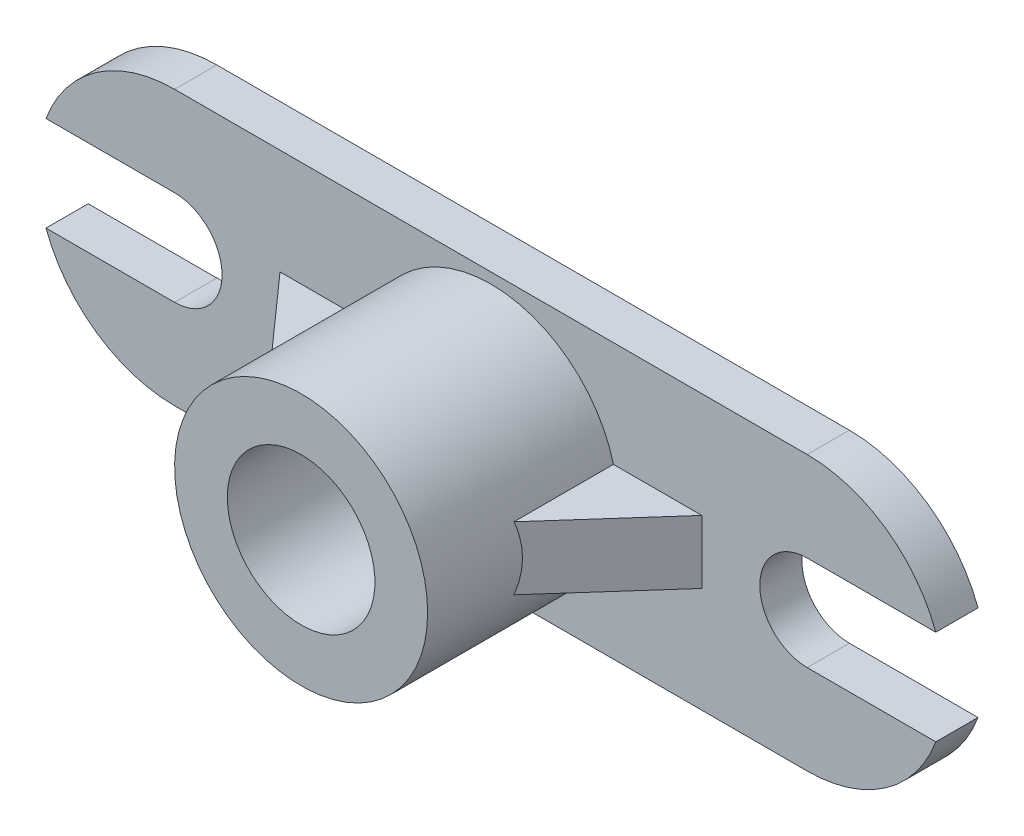
ISO-10303-21;
HEADER;
FILE_DESCRIPTION(('STEP AP214'),'2;1');
FILE_NAME('part.step','',(''),(''),'','','');
FILE_SCHEMA(('AUTOMOTIVE_DESIGN { 1 0 10303 214 1 1 1 1 }'));
ENDSEC;
DATA;
#1=APPLICATION_CONTEXT('core data for automotive mechanical design processes');
#2=APPLICATION_PROTOCOL_DEFINITION('international standard','automotive_design',2000,#1);
#3=PRODUCT_CONTEXT('',#1,'mechanical');
#4=PRODUCT('Part','Part','',(#3));
#5=PRODUCT_RELATED_PRODUCT_CATEGORY('part','',(#4));
#6=PRODUCT_DEFINITION_FORMATION('','',#4);
#7=PRODUCT_DEFINITION_CONTEXT('part definition',#1,'design');
#8=PRODUCT_DEFINITION('design','',#6,#7);
#9=PRODUCT_DEFINITION_SHAPE('','',#8);
#10=(LENGTH_UNIT() NAMED_UNIT(*) SI_UNIT(.MILLI.,.METRE.));
#11=(NAMED_UNIT(*) PLANE_ANGLE_UNIT() SI_UNIT($,.RADIAN.));
#12=(NAMED_UNIT(*) SI_UNIT($,.STERADIAN.) SOLID_ANGLE_UNIT());
#13=UNCERTAINTY_MEASURE_WITH_UNIT(LENGTH_MEASURE(1.E-05),#10,'distance_accuracy_value','');
#14=(GEOMETRIC_REPRESENTATION_CONTEXT(3) GLOBAL_UNCERTAINTY_ASSIGNED_CONTEXT((#13)) GLOBAL_UNIT_ASSIGNED_CONTEXT((#10,
#11,#12)) REPRESENTATION_CONTEXT('',''));
#15=CARTESIAN_POINT('',(0.,0.,0.));
#16=DIRECTION('',(0.,0.,1.));
#17=DIRECTION('',(1.,0.,0.));
#18=AXIS2_PLACEMENT_3D('',#15,#16,#17);
#19=CARTESIAN_POINT('',(30.,0.,2.));
#20=DIRECTION('',(0.,0.,-1.));
#21=DIRECTION('',(-1.,0.,0.));
#22=AXIS2_PLACEMENT_3D('',#19,#20,#21);
#23=CYLINDRICAL_SURFACE('',#22,2.25);
#24=CARTESIAN_POINT('',(30.,0.,2.));
#25=DIRECTION('',(0.,0.,1.));
#26=DIRECTION('',(1.,0.,0.));
#27=AXIS2_PLACEMENT_3D('',#24,#25,#26);
#28=CIRCLE('',#27,2.25);
#29=CARTESIAN_POINT('',(30.,2.25,2.));
#30=VERTEX_POINT('',#29);
#31=CARTESIAN_POINT('',(30.,-2.25,2.));
#32=VERTEX_POINT('',#31);
#33=EDGE_CURVE('E213',#30,#32,#28,.T.);
#34=ORIENTED_EDGE('',*,*,#33,.T.);
#35=DIRECTION('',(0.,0.,-1.));
#36=VECTOR('',#35,1.);
#37=CARTESIAN_POINT('',(30.,-2.25,2.));
#38=LINE('',#37,#36);
#39=CARTESIAN_POINT('',(30.,-2.25,0.));
#40=VERTEX_POINT('',#39);
#41=EDGE_CURVE('E242',#32,#40,#38,.T.);
#42=ORIENTED_EDGE('',*,*,#41,.T.);
#43=CARTESIAN_POINT('',(30.,0.,0.));
#44=DIRECTION('',(0.,0.,1.));
#45=DIRECTION('',(1.,0.,0.));
#46=AXIS2_PLACEMENT_3D('',#43,#44,#45);
#47=CIRCLE('',#46,2.25);
#48=CARTESIAN_POINT('',(30.,2.25,0.));
#49=VERTEX_POINT('',#48);
#50=EDGE_CURVE('E210',#49,#40,#47,.T.);
#51=ORIENTED_EDGE('',*,*,#50,.F.);
#52=DIRECTION('',(0.,0.,-1.));
#53=VECTOR('',#52,1.);
#54=CARTESIAN_POINT('',(30.,2.25,2.));
#55=LINE('',#54,#53);
#56=EDGE_CURVE('E295',#30,#49,#55,.T.);
#57=ORIENTED_EDGE('',*,*,#56,.F.);
#58=EDGE_LOOP('',(#34,#42,#51,#57));
#59=FACE_BOUND('',#58,.T.);
#60=ADVANCED_FACE('F37',(#59),#23,.F.);
#61=CARTESIAN_POINT('',(0.,2.24999999999999,2.));
#62=DIRECTION('',(0.,1.,0.));
#63=DIRECTION('',(-1.,0.,0.));
#64=AXIS2_PLACEMENT_3D('',#61,#62,#63);
#65=PLANE('',#64);
#66=DIRECTION('',(1.,0.,0.));
#67=VECTOR('',#66,1.);
#68=CARTESIAN_POINT('',(0.,2.24999999999999,0.));
#69=LINE('',#68,#67);
#70=CARTESIAN_POINT('',(36.0981554588252,2.25,0.));
#71=VERTEX_POINT('',#70);
#72=EDGE_CURVE('E244',#49,#71,#69,.T.);
#73=ORIENTED_EDGE('',*,*,#72,.T.);
#74=DIRECTION('',(0.,0.,-1.));
#75=VECTOR('',#74,1.);
#76=CARTESIAN_POINT('',(36.0981554588252,2.25,2.));
#77=LINE('',#76,#75);
#78=CARTESIAN_POINT('',(36.0981554588252,2.25,2.));
#79=VERTEX_POINT('',#78);
#80=EDGE_CURVE('E292',#79,#71,#77,.T.);
#81=ORIENTED_EDGE('',*,*,#80,.F.);
#82=DIRECTION('',(1.,0.,0.));
#83=VECTOR('',#82,1.);
#84=CARTESIAN_POINT('',(0.,2.24999999999999,2.));
#85=LINE('',#84,#83);
#86=EDGE_CURVE('E215',#30,#79,#85,.T.);
#87=ORIENTED_EDGE('',*,*,#86,.F.);
#88=ORIENTED_EDGE('',*,*,#56,.T.);
#89=EDGE_LOOP('',(#73,#81,#87,#88));
#90=FACE_BOUND('',#89,.T.);
#91=ADVANCED_FACE('F322',(#90),#65,.F.);
#92=CARTESIAN_POINT('',(30.,0.,2.));
#93=DIRECTION('',(0.,0.,-1.));
#94=DIRECTION('',(-1.,0.,0.));
#95=AXIS2_PLACEMENT_3D('',#92,#93,#94);
#96=CYLINDRICAL_SURFACE('',#95,6.5);
#97=CARTESIAN_POINT('',(30.,0.,0.));
#98=DIRECTION('',(0.,0.,1.));
#99=DIRECTION('',(1.,0.,0.));
#100=AXIS2_PLACEMENT_3D('',#97,#98,#99);
#101=CIRCLE('',#100,6.5);
#102=CARTESIAN_POINT('',(30.,6.5,0.));
#103=VERTEX_POINT('',#102);
#104=EDGE_CURVE('E246',#71,#103,#101,.T.);
#105=ORIENTED_EDGE('',*,*,#104,.T.);
#106=DIRECTION('',(0.,0.,-1.));
#107=VECTOR('',#106,1.);
#108=CARTESIAN_POINT('',(30.,6.5,2.));
#109=LINE('',#108,#107);
#110=CARTESIAN_POINT('',(30.,6.5,2.));
#111=VERTEX_POINT('',#110);
#112=EDGE_CURVE('E290',#111,#103,#109,.T.);
#113=ORIENTED_EDGE('',*,*,#112,.F.);
#114=CARTESIAN_POINT('',(30.,0.,2.));
#115=DIRECTION('',(0.,0.,1.));
#116=DIRECTION('',(1.,0.,0.));
#117=AXIS2_PLACEMENT_3D('',#114,#115,#116);
#118=CIRCLE('',#117,6.5);
#119=EDGE_CURVE('E218',#79,#111,#118,.T.);
#120=ORIENTED_EDGE('',*,*,#119,.F.);
#121=ORIENTED_EDGE('',*,*,#80,.T.);
#122=EDGE_LOOP('',(#105,#113,#120,#121));
#123=FACE_BOUND('',#122,.T.);
#124=ADVANCED_FACE('F327',(#123),#96,.T.);
#125=CARTESIAN_POINT('',(0.,6.5,2.));
#126=DIRECTION('',(0.,1.,0.));
#127=DIRECTION('',(0.,0.,1.));
#128=AXIS2_PLACEMENT_3D('',#125,#126,#127);
#129=PLANE('',#128);
#130=DIRECTION('',(1.,0.,0.));
#131=VECTOR('',#130,1.);
#132=CARTESIAN_POINT('',(0.,6.5,0.));
#133=LINE('',#132,#131);
#134=CARTESIAN_POINT('',(0.,6.5,0.));
#135=VERTEX_POINT('',#134);
#136=EDGE_CURVE('E249',#135,#103,#133,.T.);
#137=ORIENTED_EDGE('',*,*,#136,.F.);
#138=DIRECTION('',(0.,0.,-1.));
#139=VECTOR('',#138,1.);
#140=CARTESIAN_POINT('',(0.,6.5,2.));
#141=LINE('',#140,#139);
#142=CARTESIAN_POINT('',(0.,6.5,2.));
#143=VERTEX_POINT('',#142);
#144=EDGE_CURVE('E288',#143,#135,#141,.T.);
#145=ORIENTED_EDGE('',*,*,#144,.F.);
#146=DIRECTION('',(1.,0.,0.));
#147=VECTOR('',#146,1.);
#148=CARTESIAN_POINT('',(0.,6.5,2.));
#149=LINE('',#148,#147);
#150=EDGE_CURVE('E220',#143,#111,#149,.T.);
#151=ORIENTED_EDGE('',*,*,#150,.T.);
#152=ORIENTED_EDGE('',*,*,#112,.T.);
#153=EDGE_LOOP('',(#137,#145,#151,#152));
#154=FACE_BOUND('',#153,.T.);
#155=ADVANCED_FACE('F360',(#154),#129,.T.);
#156=CARTESIAN_POINT('',(0.,0.,2.));
#157=DIRECTION('',(0.,0.,-1.));
#158=DIRECTION('',(-1.,0.,0.));
#159=AXIS2_PLACEMENT_3D('',#156,#157,#158);
#160=CYLINDRICAL_SURFACE('',#159,6.5);
#161=CARTESIAN_POINT('',(0.,0.,0.));
#162=DIRECTION('',(0.,0.,1.));
#163=DIRECTION('',(1.,0.,0.));
#164=AXIS2_PLACEMENT_3D('',#161,#162,#163);
#165=CIRCLE('',#164,6.5);
#166=CARTESIAN_POINT('',(-6.09815545882523,2.25,0.));
#167=VERTEX_POINT('',#166);
#168=EDGE_CURVE('E253',#135,#167,#165,.T.);
#169=ORIENTED_EDGE('',*,*,#168,.T.);
#170=DIRECTION('',(0.,0.,-1.));
#171=VECTOR('',#170,1.);
#172=CARTESIAN_POINT('',(-6.09815545882523,2.25,2.));
#173=LINE('',#172,#171);
#174=CARTESIAN_POINT('',(-6.09815545882523,2.25,2.));
#175=VERTEX_POINT('',#174);
#176=EDGE_CURVE('E286',#175,#167,#173,.T.);
#177=ORIENTED_EDGE('',*,*,#176,.F.);
#178=CARTESIAN_POINT('',(0.,0.,2.));
#179=DIRECTION('',(0.,0.,1.));
#180=DIRECTION('',(1.,0.,0.));
#181=AXIS2_PLACEMENT_3D('',#178,#179,#180);
#182=CIRCLE('',#181,6.5);
#183=EDGE_CURVE('E224',#143,#175,#182,.T.);
#184=ORIENTED_EDGE('',*,*,#183,.F.);
#185=ORIENTED_EDGE('',*,*,#144,.T.);
#186=EDGE_LOOP('',(#169,#177,#184,#185));
#187=FACE_BOUND('',#186,.T.);
#188=ADVANCED_FACE('F363',(#187),#160,.T.);
#189=CARTESIAN_POINT('',(0.,2.25,2.));
#190=DIRECTION('',(0.,-1.,0.));
#191=DIRECTION('',(1.,0.,0.));
#192=AXIS2_PLACEMENT_3D('',#189,#190,#191);
#193=PLANE('',#192);
#194=DIRECTION('',(-1.,0.,0.));
#195=VECTOR('',#194,1.);
#196=CARTESIAN_POINT('',(0.,2.25,0.));
#197=LINE('',#196,#195);
#198=CARTESIAN_POINT('',(0.,2.25,0.));
#199=VERTEX_POINT('',#198);
#200=EDGE_CURVE('E256',#199,#167,#197,.T.);
#201=ORIENTED_EDGE('',*,*,#200,.F.);
#202=DIRECTION('',(0.,0.,-1.));
#203=VECTOR('',#202,1.);
#204=CARTESIAN_POINT('',(0.,2.25,2.));
#205=LINE('',#204,#203);
#206=CARTESIAN_POINT('',(0.,2.25,2.));
#207=VERTEX_POINT('',#206);
#208=EDGE_CURVE('E283',#207,#199,#205,.T.);
#209=ORIENTED_EDGE('',*,*,#208,.F.);
#210=DIRECTION('',(-1.,0.,0.));
#211=VECTOR('',#210,1.);
#212=CARTESIAN_POINT('',(0.,2.25,2.));
#213=LINE('',#212,#211);
#214=EDGE_CURVE('E226',#207,#175,#213,.T.);
#215=ORIENTED_EDGE('',*,*,#214,.T.);
#216=ORIENTED_EDGE('',*,*,#176,.T.);
#217=EDGE_LOOP('',(#201,#209,#215,#216));
#218=FACE_BOUND('',#217,.T.);
#219=ADVANCED_FACE('F367',(#218),#193,.T.);
#220=CARTESIAN_POINT('',(0.,0.,2.));
#221=DIRECTION('',(0.,0.,-1.));
#222=DIRECTION('',(-1.,0.,0.));
#223=AXIS2_PLACEMENT_3D('',#220,#221,#222);
#224=CYLINDRICAL_SURFACE('',#223,2.25);
#225=CARTESIAN_POINT('',(0.,0.,2.));
#226=DIRECTION('',(0.,0.,1.));
#227=DIRECTION('',(1.,0.,0.));
#228=AXIS2_PLACEMENT_3D('',#225,#226,#227);
#229=CIRCLE('',#228,2.25);
#230=CARTESIAN_POINT('',(0.,-2.25,2.));
#231=VERTEX_POINT('',#230);
#232=EDGE_CURVE('E230',#231,#207,#229,.T.);
#233=ORIENTED_EDGE('',*,*,#232,.T.);
#234=ORIENTED_EDGE('',*,*,#208,.T.);
#235=CARTESIAN_POINT('',(0.,0.,0.));
#236=DIRECTION('',(0.,0.,1.));
#237=DIRECTION('',(1.,0.,0.));
#238=AXIS2_PLACEMENT_3D('',#235,#236,#237);
#239=CIRCLE('',#238,2.25);
#240=CARTESIAN_POINT('',(0.,-2.25,0.));
#241=VERTEX_POINT('',#240);
#242=EDGE_CURVE('E260',#241,#199,#239,.T.);
#243=ORIENTED_EDGE('',*,*,#242,.F.);
#244=DIRECTION('',(0.,0.,-1.));
#245=VECTOR('',#244,1.);
#246=CARTESIAN_POINT('',(0.,-2.25,2.));
#247=LINE('',#246,#245);
#248=EDGE_CURVE('E281',#231,#241,#247,.T.);
#249=ORIENTED_EDGE('',*,*,#248,.F.);
#250=EDGE_LOOP('',(#233,#234,#243,#249));
#251=FACE_BOUND('',#250,.T.);
#252=ADVANCED_FACE('F372',(#251),#224,.F.);
#253=CARTESIAN_POINT('',(0.,-2.25,2.));
#254=DIRECTION('',(0.,-1.,0.));
#255=DIRECTION('',(1.,0.,0.));
#256=AXIS2_PLACEMENT_3D('',#253,#254,#255);
#257=PLANE('',#256);
#258=DIRECTION('',(-1.,0.,0.));
#259=VECTOR('',#258,1.);
#260=CARTESIAN_POINT('',(0.,-2.25,0.));
#261=LINE('',#260,#259);
#262=CARTESIAN_POINT('',(-6.09815545882523,-2.25,0.));
#263=VERTEX_POINT('',#262);
#264=EDGE_CURVE('E262',#241,#263,#261,.T.);
#265=ORIENTED_EDGE('',*,*,#264,.T.);
#266=DIRECTION('',(0.,0.,-1.));
#267=VECTOR('',#266,1.);
#268=CARTESIAN_POINT('',(-6.09815545882523,-2.25,2.));
#269=LINE('',#268,#267);
#270=CARTESIAN_POINT('',(-6.09815545882523,-2.25,2.));
#271=VERTEX_POINT('',#270);
#272=EDGE_CURVE('E278',#271,#263,#269,.T.);
#273=ORIENTED_EDGE('',*,*,#272,.F.);
#274=DIRECTION('',(-1.,0.,0.));
#275=VECTOR('',#274,1.);
#276=CARTESIAN_POINT('',(0.,-2.25,2.));
#277=LINE('',#276,#275);
#278=EDGE_CURVE('E232',#231,#271,#277,.T.);
#279=ORIENTED_EDGE('',*,*,#278,.F.);
#280=ORIENTED_EDGE('',*,*,#248,.T.);
#281=EDGE_LOOP('',(#265,#273,#279,#280));
#282=FACE_BOUND('',#281,.T.);
#283=ADVANCED_FACE('F376',(#282),#257,.F.);
#284=CARTESIAN_POINT('',(0.,-6.5,0.));
#285=VERTEX_POINT('',#284);
#286=EDGE_CURVE('E257',#263,#285,#165,.T.);
#287=ORIENTED_EDGE('',*,*,#286,.T.);
#288=DIRECTION('',(0.,0.,-1.));
#289=VECTOR('',#288,1.);
#290=CARTESIAN_POINT('',(0.,-6.5,2.));
#291=LINE('',#290,#289);
#292=CARTESIAN_POINT('',(0.,-6.5,2.));
#293=VERTEX_POINT('',#292);
#294=EDGE_CURVE('E275',#293,#285,#291,.T.);
#295=ORIENTED_EDGE('',*,*,#294,.F.);
#296=EDGE_CURVE('E227',#271,#293,#182,.T.);
#297=ORIENTED_EDGE('',*,*,#296,.F.);
#298=ORIENTED_EDGE('',*,*,#272,.T.);
#299=EDGE_LOOP('',(#287,#295,#297,#298));
#300=FACE_BOUND('',#299,.T.);
#301=ADVANCED_FACE('F381',(#300),#160,.T.);
#302=CARTESIAN_POINT('',(0.,-6.5,2.));
#303=DIRECTION('',(0.,1.,0.));
#304=DIRECTION('',(0.,0.,1.));
#305=AXIS2_PLACEMENT_3D('',#302,#303,#304);
#306=PLANE('',#305);
#307=DIRECTION('',(1.,0.,0.));
#308=VECTOR('',#307,1.);
#309=CARTESIAN_POINT('',(0.,-6.5,0.));
#310=LINE('',#309,#308);
#311=CARTESIAN_POINT('',(30.,-6.5,0.));
#312=VERTEX_POINT('',#311);
#313=EDGE_CURVE('E264',#285,#312,#310,.T.);
#314=ORIENTED_EDGE('',*,*,#313,.T.);
#315=DIRECTION('',(0.,0.,-1.));
#316=VECTOR('',#315,1.);
#317=CARTESIAN_POINT('',(30.,-6.5,2.));
#318=LINE('',#317,#316);
#319=CARTESIAN_POINT('',(30.,-6.5,2.));
#320=VERTEX_POINT('',#319);
#321=EDGE_CURVE('E272',#320,#312,#318,.T.);
#322=ORIENTED_EDGE('',*,*,#321,.F.);
#323=DIRECTION('',(1.,0.,0.));
#324=VECTOR('',#323,1.);
#325=CARTESIAN_POINT('',(0.,-6.5,2.));
#326=LINE('',#325,#324);
#327=EDGE_CURVE('E234',#293,#320,#326,.T.);
#328=ORIENTED_EDGE('',*,*,#327,.F.);
#329=ORIENTED_EDGE('',*,*,#294,.T.);
#330=EDGE_LOOP('',(#314,#322,#328,#329));
#331=FACE_BOUND('',#330,.T.);
#332=ADVANCED_FACE('F383',(#331),#306,.F.);
#333=CARTESIAN_POINT('',(36.0981554588252,-2.25,0.));
#334=VERTEX_POINT('',#333);
#335=EDGE_CURVE('E250',#312,#334,#101,.T.);
#336=ORIENTED_EDGE('',*,*,#335,.T.);
#337=DIRECTION('',(0.,0.,-1.));
#338=VECTOR('',#337,1.);
#339=CARTESIAN_POINT('',(36.0981554588252,-2.25,2.));
#340=LINE('',#339,#338);
#341=CARTESIAN_POINT('',(36.0981554588252,-2.25,2.));
#342=VERTEX_POINT('',#341);
#343=EDGE_CURVE('E270',#342,#334,#340,.T.);
#344=ORIENTED_EDGE('',*,*,#343,.F.);
#345=EDGE_CURVE('E221',#320,#342,#118,.T.);
#346=ORIENTED_EDGE('',*,*,#345,.F.);
#347=ORIENTED_EDGE('',*,*,#321,.T.);
#348=EDGE_LOOP('',(#336,#344,#346,#347));
#349=FACE_BOUND('',#348,.T.);
#350=ADVANCED_FACE('F344',(#349),#96,.T.);
#351=CARTESIAN_POINT('',(0.,-2.25000000000001,2.));
#352=DIRECTION('',(0.,1.,0.));
#353=DIRECTION('',(-1.,0.,0.));
#354=AXIS2_PLACEMENT_3D('',#351,#352,#353);
#355=PLANE('',#354);
#356=DIRECTION('',(1.,0.,0.));
#357=VECTOR('',#356,1.);
#358=CARTESIAN_POINT('',(0.,-2.25000000000001,0.));
#359=LINE('',#358,#357);
#360=EDGE_CURVE('E216',#40,#334,#359,.T.);
#361=ORIENTED_EDGE('',*,*,#360,.F.);
#362=ORIENTED_EDGE('',*,*,#41,.F.);
#363=DIRECTION('',(1.,0.,0.));
#364=VECTOR('',#363,1.);
#365=CARTESIAN_POINT('',(0.,-2.25000000000001,2.));
#366=LINE('',#365,#364);
#367=EDGE_CURVE('E236',#32,#342,#366,.T.);
#368=ORIENTED_EDGE('',*,*,#367,.T.);
#369=ORIENTED_EDGE('',*,*,#343,.T.);
#370=EDGE_LOOP('',(#361,#362,#368,#369));
#371=FACE_BOUND('',#370,.T.);
#372=ADVANCED_FACE('F336',(#371),#355,.T.);
#373=CARTESIAN_POINT('',(0.,0.,2.));
#374=DIRECTION('',(0.,0.,1.));
#375=DIRECTION('',(1.,0.,0.));
#376=AXIS2_PLACEMENT_3D('',#373,#374,#375);
#377=PLANE('',#376);
#378=DIRECTION('',(-1.,0.,0.));
#379=VECTOR('',#378,1.);
#380=CARTESIAN_POINT('',(0.,-1.5,2.));
#381=LINE('',#380,#379);
#382=CARTESIAN_POINT('',(9.19052498068887,-1.5,2.));
#383=VERTEX_POINT('',#382);
#384=CARTESIAN_POINT('',(5.,-1.5,2.));
#385=VERTEX_POINT('',#384);
#386=EDGE_CURVE('E191',#383,#385,#381,.T.);
#387=ORIENTED_EDGE('',*,*,#386,.T.);
#388=DIRECTION('',(0.,-1.,0.));
#389=VECTOR('',#388,1.);
#390=CARTESIAN_POINT('',(5.,0.,2.));
#391=LINE('',#390,#389);
#392=CARTESIAN_POINT('',(5.,1.5,2.));
#393=VERTEX_POINT('',#392);
#394=EDGE_CURVE('E199',#393,#385,#391,.T.);
#395=ORIENTED_EDGE('',*,*,#394,.F.);
#396=DIRECTION('',(-1.,0.,0.));
#397=VECTOR('',#396,1.);
#398=CARTESIAN_POINT('',(0.,1.5,2.));
#399=LINE('',#398,#397);
#400=CARTESIAN_POINT('',(9.19052498068887,1.5,2.));
#401=VERTEX_POINT('',#400);
#402=EDGE_CURVE('E196',#401,#393,#399,.T.);
#403=ORIENTED_EDGE('',*,*,#402,.F.);
#404=CARTESIAN_POINT('',(15.,0.,2.));
#405=DIRECTION('',(0.,0.,1.));
#406=DIRECTION('',(1.,0.,0.));
#407=AXIS2_PLACEMENT_3D('',#404,#405,#406);
#408=CIRCLE('',#407,6.);
#409=CARTESIAN_POINT('',(20.8094750193111,1.5,2.));
#410=VERTEX_POINT('',#409);
#411=EDGE_CURVE('E239',#410,#401,#408,.T.);
#412=ORIENTED_EDGE('',*,*,#411,.F.);
#413=DIRECTION('',(1.,0.,0.));
#414=VECTOR('',#413,1.);
#415=CARTESIAN_POINT('',(0.,1.5,2.));
#416=LINE('',#415,#414);
#417=CARTESIAN_POINT('',(25.,1.5,2.));
#418=VERTEX_POINT('',#417);
#419=EDGE_CURVE('E56',#410,#418,#416,.T.);
#420=ORIENTED_EDGE('',*,*,#419,.T.);
#421=DIRECTION('',(0.,1.,0.));
#422=VECTOR('',#421,1.);
#423=CARTESIAN_POINT('',(25.,0.,2.));
#424=LINE('',#423,#422);
#425=CARTESIAN_POINT('',(25.,-1.5,2.));
#426=VERTEX_POINT('',#425);
#427=EDGE_CURVE('E51',#426,#418,#424,.T.);
#428=ORIENTED_EDGE('',*,*,#427,.F.);
#429=DIRECTION('',(1.,0.,0.));
#430=VECTOR('',#429,1.);
#431=CARTESIAN_POINT('',(0.,-1.5,2.));
#432=LINE('',#431,#430);
#433=CARTESIAN_POINT('',(20.8094750193111,-1.5,2.));
#434=VERTEX_POINT('',#433);
#435=EDGE_CURVE('E173',#434,#426,#432,.T.);
#436=ORIENTED_EDGE('',*,*,#435,.F.);
#437=EDGE_CURVE('E240',#383,#434,#408,.T.);
#438=ORIENTED_EDGE('',*,*,#437,.F.);
#439=EDGE_LOOP('',(#387,#395,#403,#412,#420,#428,#436,#438));
#440=FACE_BOUND('',#439,.T.);
#441=ORIENTED_EDGE('',*,*,#214,.F.);
#442=ORIENTED_EDGE('',*,*,#232,.F.);
#443=ORIENTED_EDGE('',*,*,#278,.T.);
#444=ORIENTED_EDGE('',*,*,#296,.T.);
#445=ORIENTED_EDGE('',*,*,#327,.T.);
#446=ORIENTED_EDGE('',*,*,#345,.T.);
#447=ORIENTED_EDGE('',*,*,#367,.F.);
#448=ORIENTED_EDGE('',*,*,#33,.F.);
#449=ORIENTED_EDGE('',*,*,#86,.T.);
#450=ORIENTED_EDGE('',*,*,#119,.T.);
#451=ORIENTED_EDGE('',*,*,#150,.F.);
#452=ORIENTED_EDGE('',*,*,#183,.T.);
#453=EDGE_LOOP('',(#441,#442,#443,#444,#445,#446,#447,#448,#449,#450,#451,#452));
#454=FACE_BOUND('',#453,.T.);
#455=ADVANCED_FACE('F307',(#440,#454),#377,.T.);
#456=CARTESIAN_POINT('',(0.,0.,0.));
#457=DIRECTION('',(0.,0.,1.));
#458=DIRECTION('',(1.,0.,0.));
#459=AXIS2_PLACEMENT_3D('',#456,#457,#458);
#460=PLANE('',#459);
#461=CARTESIAN_POINT('',(15.,0.,0.));
#462=DIRECTION('',(0.,0.,1.));
#463=DIRECTION('',(1.,0.,0.));
#464=AXIS2_PLACEMENT_3D('',#461,#462,#463);
#465=CIRCLE('',#464,3.5);
#466=CARTESIAN_POINT('',(11.5,0.,0.));
#467=VERTEX_POINT('',#466);
#468=EDGE_CURVE('E203',#467,#467,#465,.T.);
#469=ORIENTED_EDGE('',*,*,#468,.T.);
#470=EDGE_LOOP('',(#469));
#471=FACE_BOUND('',#470,.T.);
#472=ORIENTED_EDGE('',*,*,#242,.T.);
#473=ORIENTED_EDGE('',*,*,#200,.T.);
#474=ORIENTED_EDGE('',*,*,#168,.F.);
#475=ORIENTED_EDGE('',*,*,#136,.T.);
#476=ORIENTED_EDGE('',*,*,#104,.F.);
#477=ORIENTED_EDGE('',*,*,#72,.F.);
#478=ORIENTED_EDGE('',*,*,#50,.T.);
#479=ORIENTED_EDGE('',*,*,#360,.T.);
#480=ORIENTED_EDGE('',*,*,#335,.F.);
#481=ORIENTED_EDGE('',*,*,#313,.F.);
#482=ORIENTED_EDGE('',*,*,#286,.F.);
#483=ORIENTED_EDGE('',*,*,#264,.F.);
#484=EDGE_LOOP('',(#472,#473,#474,#475,#476,#477,#478,#479,#480,#481,#482,#483));
#485=FACE_BOUND('',#484,.T.);
#486=ADVANCED_FACE('F348',(#471,#485),#460,.F.);
#487=CARTESIAN_POINT('',(15.,0.,11.));
#488=DIRECTION('',(0.,0.,-1.));
#489=DIRECTION('',(-1.,0.,0.));
#490=AXIS2_PLACEMENT_3D('',#487,#488,#489);
#491=CYLINDRICAL_SURFACE('',#490,3.5);
#492=CARTESIAN_POINT('',(15.,0.,11.));
#493=DIRECTION('',(0.,0.,1.));
#494=DIRECTION('',(1.,0.,0.));
#495=AXIS2_PLACEMENT_3D('',#492,#493,#494);
#496=CIRCLE('',#495,3.5);
#497=CARTESIAN_POINT('',(11.5,0.,11.));
#498=VERTEX_POINT('',#497);
#499=EDGE_CURVE('E204',#498,#498,#496,.T.);
#500=CARTESIAN_POINT('',(11.5,0.,0.));
#501=CARTESIAN_POINT('',(11.5,0.,0.114583333333332));
#502=CARTESIAN_POINT('',(11.5,0.,0.229166666666665));
#503=CARTESIAN_POINT('',(11.5,0.,0.458333333333333));
#504=CARTESIAN_POINT('',(11.5,0.,0.572916666666667));
#505=CARTESIAN_POINT('',(11.5,0.,0.802083333333334));
#506=CARTESIAN_POINT('',(11.5,0.,0.916666666666668));
#507=CARTESIAN_POINT('',(11.5,0.,1.14583333333333));
#508=CARTESIAN_POINT('',(11.5,0.,1.26041666666667));
#509=CARTESIAN_POINT('',(11.5,0.,1.48958333333334));
#510=CARTESIAN_POINT('',(11.5,0.,1.60416666666667));
#511=CARTESIAN_POINT('',(11.5,0.,1.83333333333334));
#512=CARTESIAN_POINT('',(11.5,0.,1.94791666666667));
#513=CARTESIAN_POINT('',(11.5,0.,2.17708333333334));
#514=CARTESIAN_POINT('',(11.5,0.,2.29166666666667));
#515=CARTESIAN_POINT('',(11.5,0.,2.52083333333334));
#516=CARTESIAN_POINT('',(11.5,0.,2.63541666666667));
#517=CARTESIAN_POINT('',(11.5,0.,2.86458333333334));
#518=CARTESIAN_POINT('',(11.5,0.,2.97916666666667));
#519=CARTESIAN_POINT('',(11.5,0.,3.20833333333334));
#520=CARTESIAN_POINT('',(11.5,0.,3.32291666666667));
#521=CARTESIAN_POINT('',(11.5,0.,3.55208333333334));
#522=CARTESIAN_POINT('',(11.5,0.,3.66666666666667));
#523=CARTESIAN_POINT('',(11.5,0.,3.89583333333334));
#524=CARTESIAN_POINT('',(11.5,0.,4.01041666666667));
#525=CARTESIAN_POINT('',(11.5,0.,4.23958333333334));
#526=CARTESIAN_POINT('',(11.5,0.,4.35416666666668));
#527=CARTESIAN_POINT('',(11.5,0.,4.58333333333334));
#528=CARTESIAN_POINT('',(11.5,0.,4.69791666666668));
#529=CARTESIAN_POINT('',(11.5,0.,4.92708333333334));
#530=CARTESIAN_POINT('',(11.5,0.,5.04166666666668));
#531=CARTESIAN_POINT('',(11.5,0.,5.27083333333334));
#532=CARTESIAN_POINT('',(11.5,0.,5.38541666666668));
#533=CARTESIAN_POINT('',(11.5,0.,5.61458333333335));
#534=CARTESIAN_POINT('',(11.5,0.,5.72916666666668));
#535=CARTESIAN_POINT('',(11.5,0.,5.95833333333335));
#536=CARTESIAN_POINT('',(11.5,0.,6.07291666666668));
#537=CARTESIAN_POINT('',(11.5,0.,6.30208333333335));
#538=CARTESIAN_POINT('',(11.5,0.,6.41666666666668));
#539=CARTESIAN_POINT('',(11.5,0.,6.64583333333335));
#540=CARTESIAN_POINT('',(11.5,0.,6.76041666666668));
#541=CARTESIAN_POINT('',(11.5,0.,6.98958333333335));
#542=CARTESIAN_POINT('',(11.5,0.,7.10416666666668));
#543=CARTESIAN_POINT('',(11.5,0.,7.33333333333335));
#544=CARTESIAN_POINT('',(11.5,0.,7.44791666666668));
#545=CARTESIAN_POINT('',(11.5,0.,7.67708333333335));
#546=CARTESIAN_POINT('',(11.5,0.,7.79166666666668));
#547=CARTESIAN_POINT('',(11.5,0.,8.02083333333335));
#548=CARTESIAN_POINT('',(11.5,0.,8.13541666666669));
#549=CARTESIAN_POINT('',(11.5,0.,8.36458333333335));
#550=CARTESIAN_POINT('',(11.5,0.,8.47916666666669));
#551=CARTESIAN_POINT('',(11.5,0.,8.70833333333335));
#552=CARTESIAN_POINT('',(11.5,0.,8.82291666666669));
#553=CARTESIAN_POINT('',(11.5,0.,9.05208333333335));
#554=CARTESIAN_POINT('',(11.5,0.,9.16666666666669));
#555=CARTESIAN_POINT('',(11.5,0.,9.39583333333336));
#556=CARTESIAN_POINT('',(11.5,0.,9.51041666666669));
#557=CARTESIAN_POINT('',(11.5,0.,9.73958333333336));
#558=CARTESIAN_POINT('',(11.5,0.,9.85416666666669));
#559=CARTESIAN_POINT('',(11.5,0.,10.0833333333334));
#560=CARTESIAN_POINT('',(11.5,0.,10.1979166666667));
#561=CARTESIAN_POINT('',(11.5,0.,10.4270833333334));
#562=CARTESIAN_POINT('',(11.5,0.,10.5416666666667));
#563=CARTESIAN_POINT('',(11.5,0.,10.7708333333334));
#564=CARTESIAN_POINT('',(11.5,0.,10.8854166666667));
#565=CARTESIAN_POINT('',(11.5,0.,11.));
#566=B_SPLINE_CURVE_WITH_KNOTS('',3,(#500,#501,#502,#503,#504,#505,#506,#507,#508,#509,#510,
#511,#512,#513,#514,#515,#516,#517,#518,#519,#520,#521,#522,#523,#524,#525,#526,#527,#528,#529,
#530,#531,#532,#533,#534,#535,#536,#537,#538,#539,#540,#541,#542,#543,#544,#545,#546,#547,#548,
#549,#550,#551,#552,#553,#554,#555,#556,#557,#558,#559,#560,#561,#562,#563,#564,#565),
.UNSPECIFIED.,.F.,.F.,(4,2,2,2,2,2,2,2,2,2,2,2,2,2,2,2,2,2,2,2,2,2,2,2,2,2,2,2,2,2,2,2,4),(0.,
0.34375,0.687500000000002,1.03125,1.375,1.71875,2.06250000000001,2.40625000000001,
2.75000000000001,3.09375000000001,3.43750000000001,3.78125000000001,4.12500000000001,
4.46875000000001,4.81250000000001,5.15625000000001,5.50000000000001,5.84375000000002,
6.18750000000002,6.53125000000002,6.87500000000002,7.21875000000002,7.56250000000002,
7.90625000000002,8.25000000000002,8.59375000000002,8.93750000000002,9.28125000000002,
9.62500000000002,9.96875000000002,10.3125,10.65625,11.),.UNSPECIFIED.);
#567=EDGE_CURVE('BSEAM478',#467,#498,#566,.T.);
#568=ORIENTED_EDGE('',*,*,#468,.F.);
#569=ORIENTED_EDGE('',*,*,#499,.T.);
#570=ORIENTED_EDGE('',*,*,#567,.T.);
#571=ORIENTED_EDGE('',*,*,#567,.F.);
#572=EDGE_LOOP('',(#568,#570,#569,#571));
#573=FACE_BOUND('',#572,.T.);
#574=ADVANCED_FACE('F478',(#573),#491,.F.);
#575=CARTESIAN_POINT('',(15.,0.,11.));
#576=DIRECTION('',(0.,0.,-1.));
#577=DIRECTION('',(-1.,0.,0.));
#578=AXIS2_PLACEMENT_3D('',#575,#576,#577);
#579=CYLINDRICAL_SURFACE('',#578,6.);
#580=CARTESIAN_POINT('',(15.,0.,13.25));
#581=DIRECTION('',(-0.747409318683661,0.,0.664363838829918));
#582=DIRECTION('',(-0.664363838829918,0.,-0.747409318683661));
#583=AXIS2_PLACEMENT_3D('',#580,#581,#582);
#584=ELLIPSE('',#583,9.03119593409425,6.);
#585=CARTESIAN_POINT('',(9.19052498068887,1.5,6.714340603275));
#586=VERTEX_POINT('',#585);
#587=CARTESIAN_POINT('',(9.19052498068887,-1.5,6.71434060327501));
#588=VERTEX_POINT('',#587);
#589=EDGE_CURVE('E44',#586,#588,#584,.T.);
#590=ORIENTED_EDGE('',*,*,#589,.T.);
#591=DIRECTION('',(0.,0.,-1.));
#592=VECTOR('',#591,1.);
#593=CARTESIAN_POINT('',(9.19052498068887,-1.5,11.));
#594=LINE('',#593,#592);
#595=EDGE_CURVE('E188',#383,#588,#594,.F.);
#596=ORIENTED_EDGE('',*,*,#595,.F.);
#597=ORIENTED_EDGE('',*,*,#437,.T.);
#598=DIRECTION('',(0.,0.,-1.));
#599=VECTOR('',#598,1.);
#600=CARTESIAN_POINT('',(20.8094750193111,-1.5,11.));
#601=LINE('',#600,#599);
#602=CARTESIAN_POINT('',(20.8094750193111,-1.5,6.714340603275));
#603=VERTEX_POINT('',#602);
#604=EDGE_CURVE('E164',#434,#603,#601,.F.);
#605=ORIENTED_EDGE('',*,*,#604,.T.);
#606=CARTESIAN_POINT('',(15.,0.,13.2500000000001));
#607=DIRECTION('',(0.747409318683661,0.,0.664363838829918));
#608=DIRECTION('',(0.664363838829918,0.,-0.747409318683661));
#609=AXIS2_PLACEMENT_3D('',#606,#607,#608);
#610=ELLIPSE('',#609,9.03119593409425,6.);
#611=CARTESIAN_POINT('',(20.8094750193111,1.5,6.71434060327501));
#612=VERTEX_POINT('',#611);
#613=EDGE_CURVE('E11',#603,#612,#610,.T.);
#614=ORIENTED_EDGE('',*,*,#613,.T.);
#615=DIRECTION('',(0.,0.,-1.));
#616=VECTOR('',#615,1.);
#617=CARTESIAN_POINT('',(20.8094750193111,1.5,11.));
#618=LINE('',#617,#616);
#619=EDGE_CURVE('E161',#410,#612,#618,.F.);
#620=ORIENTED_EDGE('',*,*,#619,.F.);
#621=ORIENTED_EDGE('',*,*,#411,.T.);
#622=DIRECTION('',(0.,0.,-1.));
#623=VECTOR('',#622,1.);
#624=CARTESIAN_POINT('',(9.19052498068887,1.5,11.));
#625=LINE('',#624,#623);
#626=EDGE_CURVE('E193',#401,#586,#625,.F.);
#627=ORIENTED_EDGE('',*,*,#626,.T.);
#628=EDGE_LOOP('',(#590,#596,#597,#605,#614,#620,#621,#627));
#629=FACE_BOUND('',#628,.T.);
#630=CARTESIAN_POINT('',(15.,0.,11.));
#631=DIRECTION('',(0.,0.,1.));
#632=DIRECTION('',(1.,0.,0.));
#633=AXIS2_PLACEMENT_3D('',#630,#631,#632);
#634=CIRCLE('',#633,6.);
#635=CARTESIAN_POINT('',(21.,0.,11.));
#636=VERTEX_POINT('',#635);
#637=EDGE_CURVE('E207',#636,#636,#634,.T.);
#638=ORIENTED_EDGE('',*,*,#637,.F.);
#639=EDGE_LOOP('',(#638));
#640=FACE_BOUND('',#639,.T.);
#641=ADVANCED_FACE('F159',(#629,#640),#579,.T.);
#642=CARTESIAN_POINT('',(0.,0.,11.));
#643=DIRECTION('',(0.,0.,1.));
#644=DIRECTION('',(1.,0.,0.));
#645=AXIS2_PLACEMENT_3D('',#642,#643,#644);
#646=PLANE('',#645);
#647=ORIENTED_EDGE('',*,*,#499,.F.);
#648=EDGE_LOOP('',(#647));
#649=FACE_BOUND('',#648,.T.);
#650=ORIENTED_EDGE('',*,*,#637,.T.);
#651=EDGE_LOOP('',(#650));
#652=FACE_BOUND('',#651,.T.);
#653=ADVANCED_FACE('F318',(#649,#652),#646,.T.);
#654=CARTESIAN_POINT('',(5.,0.,2.));
#655=DIRECTION('',(-0.747409318683661,0.,0.664363838829918));
#656=DIRECTION('',(0.664363838829918,0.,0.747409318683661));
#657=AXIS2_PLACEMENT_3D('',#654,#655,#656);
#658=PLANE('',#657);
#659=DIRECTION('',(0.664363838829918,0.,0.747409318683661));
#660=VECTOR('',#659,1.);
#661=CARTESIAN_POINT('',(5.,1.5,2.));
#662=LINE('',#661,#660);
#663=EDGE_CURVE('E185',#393,#586,#662,.T.);
#664=ORIENTED_EDGE('',*,*,#663,.F.);
#665=ORIENTED_EDGE('',*,*,#394,.T.);
#666=DIRECTION('',(0.664363838829918,0.,0.747409318683661));
#667=VECTOR('',#666,1.);
#668=CARTESIAN_POINT('',(5.,-1.5,2.));
#669=LINE('',#668,#667);
#670=EDGE_CURVE('E184',#385,#588,#669,.T.);
#671=ORIENTED_EDGE('',*,*,#670,.T.);
#672=ORIENTED_EDGE('',*,*,#589,.F.);
#673=EDGE_LOOP('',(#664,#665,#671,#672));
#674=FACE_BOUND('',#673,.T.);
#675=ADVANCED_FACE('F305',(#674),#658,.T.);
#676=CARTESIAN_POINT('',(15.,1.5,5.50000000000001));
#677=DIRECTION('',(0.,1.,0.));
#678=DIRECTION('',(0.,0.,1.));
#679=AXIS2_PLACEMENT_3D('',#676,#677,#678);
#680=PLANE('',#679);
#681=ORIENTED_EDGE('',*,*,#663,.T.);
#682=ORIENTED_EDGE('',*,*,#626,.F.);
#683=ORIENTED_EDGE('',*,*,#402,.T.);
#684=EDGE_LOOP('',(#681,#682,#683));
#685=FACE_BOUND('',#684,.T.);
#686=ADVANCED_FACE('F310',(#685),#680,.T.);
#687=CARTESIAN_POINT('',(15.,-1.5,5.50000000000001));
#688=DIRECTION('',(0.,1.,0.));
#689=DIRECTION('',(0.,0.,1.));
#690=AXIS2_PLACEMENT_3D('',#687,#688,#689);
#691=PLANE('',#690);
#692=ORIENTED_EDGE('',*,*,#386,.F.);
#693=ORIENTED_EDGE('',*,*,#595,.T.);
#694=ORIENTED_EDGE('',*,*,#670,.F.);
#695=EDGE_LOOP('',(#692,#693,#694));
#696=FACE_BOUND('',#695,.T.);
#697=ADVANCED_FACE('F304',(#696),#691,.F.);
#698=CARTESIAN_POINT('',(25.,0.,2.));
#699=DIRECTION('',(0.747409318683661,0.,0.664363838829918));
#700=DIRECTION('',(-0.664363838829918,0.,0.747409318683661));
#701=AXIS2_PLACEMENT_3D('',#698,#699,#700);
#702=PLANE('',#701);
#703=DIRECTION('',(-0.664363838829918,0.,0.747409318683661));
#704=VECTOR('',#703,1.);
#705=CARTESIAN_POINT('',(25.,-1.5,2.));
#706=LINE('',#705,#704);
#707=EDGE_CURVE('E176',#426,#603,#706,.T.);
#708=ORIENTED_EDGE('',*,*,#707,.F.);
#709=ORIENTED_EDGE('',*,*,#427,.T.);
#710=DIRECTION('',(-0.664363838829918,0.,0.747409318683661));
#711=VECTOR('',#710,1.);
#712=CARTESIAN_POINT('',(25.,1.5,2.));
#713=LINE('',#712,#711);
#714=EDGE_CURVE('E172',#418,#612,#713,.T.);
#715=ORIENTED_EDGE('',*,*,#714,.T.);
#716=ORIENTED_EDGE('',*,*,#613,.F.);
#717=EDGE_LOOP('',(#708,#709,#715,#716));
#718=FACE_BOUND('',#717,.T.);
#719=ADVANCED_FACE('F175',(#718),#702,.T.);
#720=CARTESIAN_POINT('',(15.,1.5,5.50000000000001));
#721=DIRECTION('',(0.,-1.,0.));
#722=DIRECTION('',(0.,0.,-1.));
#723=AXIS2_PLACEMENT_3D('',#720,#721,#722);
#724=PLANE('',#723);
#725=ORIENTED_EDGE('',*,*,#419,.F.);
#726=ORIENTED_EDGE('',*,*,#619,.T.);
#727=ORIENTED_EDGE('',*,*,#714,.F.);
#728=EDGE_LOOP('',(#725,#726,#727));
#729=FACE_BOUND('',#728,.T.);
#730=ADVANCED_FACE('F171',(#729),#724,.F.);
#731=CARTESIAN_POINT('',(15.,-1.5,5.50000000000001));
#732=DIRECTION('',(0.,-1.,0.));
#733=DIRECTION('',(0.,0.,-1.));
#734=AXIS2_PLACEMENT_3D('',#731,#732,#733);
#735=PLANE('',#734);
#736=ORIENTED_EDGE('',*,*,#707,.T.);
#737=ORIENTED_EDGE('',*,*,#604,.F.);
#738=ORIENTED_EDGE('',*,*,#435,.T.);
#739=EDGE_LOOP('',(#736,#737,#738));
#740=FACE_BOUND('',#739,.T.);
#741=ADVANCED_FACE('F532',(#740),#735,.T.);
#742=CLOSED_SHELL('',(#60,#91,#124,#155,#188,#219,#252,#283,#301,#332,#350,#372,#455,#486,#574,
#641,#653,#675,#686,#697,#719,#730,#741));
#743=MANIFOLD_SOLID_BREP('B2',#742);
#744=ADVANCED_BREP_SHAPE_REPRESENTATION('',(#18,#743),#14);
#745=SHAPE_DEFINITION_REPRESENTATION(#9,#744);
ENDSEC;
END-ISO-10303-21;
